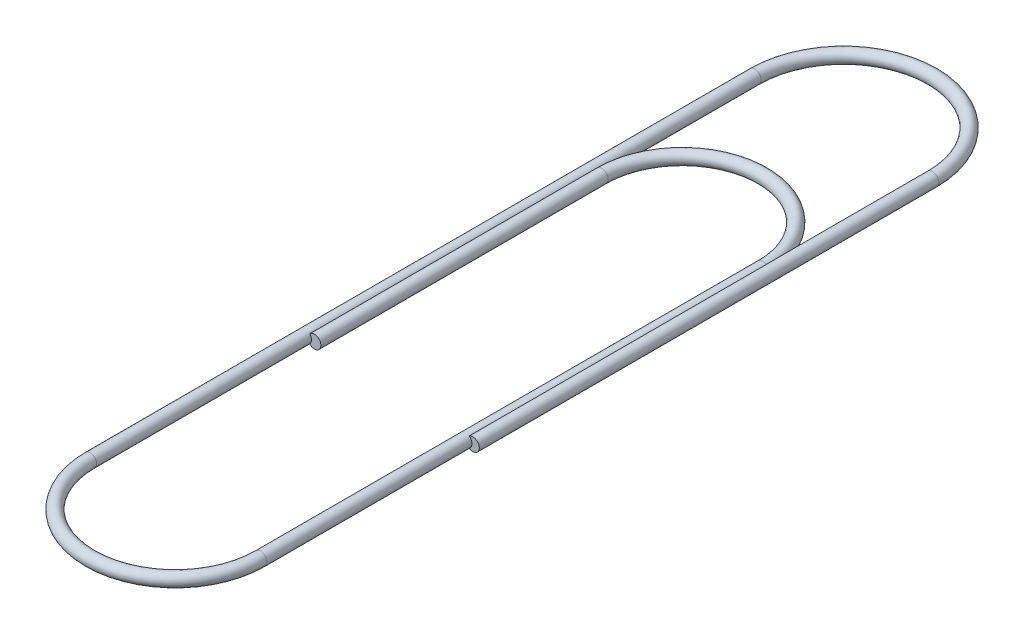
ISO-10303-21;
HEADER;
FILE_DESCRIPTION(('STEP AP214'),'2;1');
FILE_NAME('part.step','',(''),(''),'','','');
FILE_SCHEMA(('AUTOMOTIVE_DESIGN { 1 0 10303 214 1 1 1 1 }'));
ENDSEC;
DATA;
#1=APPLICATION_CONTEXT('core data for automotive mechanical design processes');
#2=APPLICATION_PROTOCOL_DEFINITION('international standard','automotive_design',2000,#1);
#3=PRODUCT_CONTEXT('',#1,'mechanical');
#4=PRODUCT('Part','Part','',(#3));
#5=PRODUCT_RELATED_PRODUCT_CATEGORY('part','',(#4));
#6=PRODUCT_DEFINITION_FORMATION('','',#4);
#7=PRODUCT_DEFINITION_CONTEXT('part definition',#1,'design');
#8=PRODUCT_DEFINITION('design','',#6,#7);
#9=PRODUCT_DEFINITION_SHAPE('','',#8);
#10=(LENGTH_UNIT() NAMED_UNIT(*) SI_UNIT(.MILLI.,.METRE.));
#11=(NAMED_UNIT(*) PLANE_ANGLE_UNIT() SI_UNIT($,.RADIAN.));
#12=(NAMED_UNIT(*) SI_UNIT($,.STERADIAN.) SOLID_ANGLE_UNIT());
#13=UNCERTAINTY_MEASURE_WITH_UNIT(LENGTH_MEASURE(1.E-05),#10,'distance_accuracy_value','');
#14=(GEOMETRIC_REPRESENTATION_CONTEXT(3) GLOBAL_UNCERTAINTY_ASSIGNED_CONTEXT((#13)) GLOBAL_UNIT_ASSIGNED_CONTEXT((#10,
#11,#12)) REPRESENTATION_CONTEXT('',''));
#15=CARTESIAN_POINT('',(0.,0.,0.));
#16=DIRECTION('',(0.,0.,1.));
#17=DIRECTION('',(1.,0.,0.));
#18=AXIS2_PLACEMENT_3D('',#15,#16,#17);
#19=CARTESIAN_POINT('',(0.,0.,0.));
#20=DIRECTION('',(0.,0.,-1.));
#21=DIRECTION('',(-1.,0.,0.));
#22=AXIS2_PLACEMENT_3D('',#19,#20,#21);
#23=CYLINDRICAL_SURFACE('',#22,0.254);
#24=CARTESIAN_POINT('',(0.,0.,0.));
#25=DIRECTION('',(0.,0.,1.));
#26=DIRECTION('',(1.,0.,0.));
#27=AXIS2_PLACEMENT_3D('',#24,#25,#26);
#28=CIRCLE('',#27,0.254);
#29=CARTESIAN_POINT('',(-0.186584561137967,-0.172343266607524,0.));
#30=VERTEX_POINT('',#29);
#31=CARTESIAN_POINT('',(-0.186584561137967,0.172343266607524,0.));
#32=VERTEX_POINT('',#31);
#33=EDGE_CURVE('E167',#30,#32,#28,.T.);
#34=ORIENTED_EDGE('',*,*,#33,.F.);
#35=DIRECTION('',(0.,0.,-1.));
#36=VECTOR('',#35,1.);
#37=CARTESIAN_POINT('',(-0.186584561137967,-0.172343266607524,-5.65589228056898));
#38=LINE('',#37,#36);
#39=CARTESIAN_POINT('',(-0.186584561137967,-0.172343266607524,-11.311784561138));
#40=VERTEX_POINT('',#39);
#41=EDGE_CURVE('E64',#30,#40,#38,.T.);
#42=ORIENTED_EDGE('',*,*,#41,.T.);
#43=CARTESIAN_POINT('',(0.,0.,-11.311784561138));
#44=DIRECTION('',(0.,0.,1.));
#45=DIRECTION('',(1.,0.,0.));
#46=AXIS2_PLACEMENT_3D('',#43,#44,#45);
#47=CIRCLE('',#46,0.254);
#48=CARTESIAN_POINT('',(-0.186584561137967,0.172343266607525,-11.311784561138));
#49=VERTEX_POINT('',#48);
#50=EDGE_CURVE('E171',#40,#49,#47,.T.);
#51=ORIENTED_EDGE('',*,*,#50,.T.);
#52=DIRECTION('',(0.,0.,-1.));
#53=VECTOR('',#52,1.);
#54=CARTESIAN_POINT('',(-0.186584561137967,0.172343266607524,-5.65589228056898));
#55=LINE('',#54,#53);
#56=EDGE_CURVE('E119',#49,#32,#55,.F.);
#57=ORIENTED_EDGE('',*,*,#56,.T.);
#58=EDGE_LOOP('',(#34,#42,#51,#57));
#59=FACE_BOUND('',#58,.T.);
#60=ADVANCED_FACE('F55',(#59),#23,.T.);
#61=CARTESIAN_POINT('',(-0.373169122275935,0.,8.4582));
#62=DIRECTION('',(0.,0.,-1.));
#63=DIRECTION('',(-1.,0.,0.));
#64=AXIS2_PLACEMENT_3D('',#61,#62,#63);
#65=CYLINDRICAL_SURFACE('',#64,0.254);
#66=CARTESIAN_POINT('',(-0.373169122275935,0.,8.4582));
#67=DIRECTION('',(0.,0.,1.));
#68=DIRECTION('',(1.,0.,0.));
#69=AXIS2_PLACEMENT_3D('',#66,#67,#68);
#70=CIRCLE('',#69,0.254);
#71=CARTESIAN_POINT('',(-0.627169122275934,0.,8.4582));
#72=VERTEX_POINT('',#71);
#73=EDGE_CURVE('E183',#72,#72,#70,.T.);
#74=ORIENTED_EDGE('',*,*,#73,.F.);
#75=EDGE_LOOP('',(#74));
#76=FACE_BOUND('',#75,.T.);
#77=CARTESIAN_POINT('',(-0.373169122275934,0.,-17.7130852795871));
#78=DIRECTION('',(0.,0.,1.));
#79=DIRECTION('',(1.,0.,0.));
#80=AXIS2_PLACEMENT_3D('',#77,#78,#79);
#81=CIRCLE('',#80,0.254);
#82=CARTESIAN_POINT('',(-0.627169122275934,0.,-17.7130852795871));
#83=VERTEX_POINT('',#82);
#84=EDGE_CURVE('E187',#83,#83,#81,.T.);
#85=ORIENTED_EDGE('',*,*,#84,.T.);
#86=EDGE_LOOP('',(#85));
#87=FACE_BOUND('',#86,.T.);
#88=CARTESIAN_POINT('',(-0.373169122275934,0.,0.));
#89=DIRECTION('',(0.,0.,1.));
#90=DIRECTION('',(1.,0.,0.));
#91=AXIS2_PLACEMENT_3D('',#88,#89,#90);
#92=CIRCLE('',#91,0.254);
#93=EDGE_CURVE('E12',#32,#30,#92,.F.);
#94=ORIENTED_EDGE('',*,*,#93,.F.);
#95=ORIENTED_EDGE('',*,*,#56,.F.);
#96=CARTESIAN_POINT('',(-0.186584558155385,-0.172343263378482,-11.311584561138));
#97=CARTESIAN_POINT('',(-0.186586348216467,-0.172330572164563,-11.3538157849771));
#98=CARTESIAN_POINT('',(-0.186188148576825,-0.171913108970192,-11.3960491957974));
#99=CARTESIAN_POINT('',(-0.184594814842463,-0.170172015622076,-11.4805070914564));
#100=CARTESIAN_POINT('',(-0.183399206966556,-0.16884784673543,-11.5227315560515));
#101=CARTESIAN_POINT('',(-0.180199896794127,-0.165180213971933,-11.6074843995857));
#102=CARTESIAN_POINT('',(-0.178189078791553,-0.162827760009676,-11.6500121282873));
#103=CARTESIAN_POINT('',(-0.173368058909582,-0.156878163210486,-11.7349276631901));
#104=CARTESIAN_POINT('',(-0.170558091677841,-0.153281385667111,-11.7773155067743));
#105=CARTESIAN_POINT('',(-0.164166707910229,-0.144440591878378,-11.861718537288));
#106=CARTESIAN_POINT('',(-0.160587835072099,-0.139201981550073,-11.9037344884641));
#107=CARTESIAN_POINT('',(-0.152691946696197,-0.126362211232276,-11.9872634904824));
#108=CARTESIAN_POINT('',(-0.148377023386179,-0.11876769915493,-12.0287776191115));
#109=CARTESIAN_POINT('',(-0.14142960680004,-0.104114492404558,-12.0902488463031));
#110=CARTESIAN_POINT('',(-0.139032601269161,-0.0986810766850316,-12.1106212973959));
#111=CARTESIAN_POINT('',(-0.134104234995789,-0.0861011052607425,-12.1509667350551));
#112=CARTESIAN_POINT('',(-0.131572405272602,-0.0789482181175577,-12.1709379425651));
#113=CARTESIAN_POINT('',(-0.127780291623346,-0.0657300990343296,-12.199890702032));
#114=CARTESIAN_POINT('',(-0.12651029404403,-0.0608759089702177,-12.2094233815019));
#115=CARTESIAN_POINT('',(-0.12403981553292,-0.0498403585831038,-12.2276882073835));
#116=CARTESIAN_POINT('',(-0.122838769467273,-0.0436726576851574,-12.2364273639686));
#117=CARTESIAN_POINT('',(-0.121448913812825,-0.0340274474268714,-12.2464252696653));
#118=CARTESIAN_POINT('',(-0.121133733108628,-0.0316324394347616,-12.248682984424));
#119=CARTESIAN_POINT('',(-0.12054830590342,-0.0265578869977523,-12.2528635452618));
#120=CARTESIAN_POINT('',(-0.120277992389521,-0.0238787768736094,-12.2547868909565));
#121=CARTESIAN_POINT('',(-0.119873889143989,-0.0190168949186507,-12.25765539599));
#122=CARTESIAN_POINT('',(-0.11972312453088,-0.016908975088872,-12.2587232613284));
#123=CARTESIAN_POINT('',(-0.119469874741796,-0.0125477767830832,-12.2605149147873));
#124=CARTESIAN_POINT('',(-0.119367329114311,-0.0102946843612895,-12.2612391337434));
#125=CARTESIAN_POINT('',(-0.119221630278729,-0.00566349794133679,-12.2622676089138));
#126=CARTESIAN_POINT('',(-0.119179137568722,-0.00328430796236838,-12.2625671948627));
#127=CARTESIAN_POINT('',(-0.119162289953431,0.00148600422398339,-12.2626860129643));
#128=CARTESIAN_POINT('',(-0.119187904763117,0.00387712065613724,-12.2625054586186));
#129=CARTESIAN_POINT('',(-0.119294598580724,0.00823297626470129,-12.2617525854919));
#130=CARTESIAN_POINT('',(-0.119367044507389,0.0102090436126411,-12.2612412374768));
#131=CARTESIAN_POINT('',(-0.119551416266909,0.0140636372209554,-12.2599382091467));
#132=CARTESIAN_POINT('',(-0.119663366133104,0.0159421033029232,-12.2591463581787));
#133=CARTESIAN_POINT('',(-0.12000146563066,0.0207658437118902,-12.2567509048164));
#134=CARTESIAN_POINT('',(-0.120254582946226,0.023612504353185,-12.2549539664389));
#135=CARTESIAN_POINT('',(-0.120815576235204,0.0290008207349535,-12.2509571088652));
#136=CARTESIAN_POINT('',(-0.121123630713269,0.0315414355581697,-12.2487558752933));
#137=CARTESIAN_POINT('',(-0.122092712811944,0.0387316878958819,-12.2418028848497));
#138=CARTESIAN_POINT('',(-0.122803142795208,0.0430006622214904,-12.2366702921147));
#139=CARTESIAN_POINT('',(-0.124278120882436,0.0508421063272673,-12.2259145947447));
#140=CARTESIAN_POINT('',(-0.125042833535231,0.0544123233435169,-12.2202899855322));
#141=CARTESIAN_POINT('',(-0.127201583482678,0.0636678131652967,-12.2042539861035));
#142=CARTESIAN_POINT('',(-0.128619678637136,0.0688211310794005,-12.1935419870365));
#143=CARTESIAN_POINT('',(-0.131455407960653,0.0781895375752967,-12.1717083547636));
#144=CARTESIAN_POINT('',(-0.132873031081389,0.0824021196667965,-12.1605857171053));
#145=CARTESIAN_POINT('',(-0.137095027915176,0.0941039862893652,-12.1267821966918));
#146=CARTESIAN_POINT('',(-0.139855828790263,0.100612312256754,-12.1037594597808));
#147=CARTESIAN_POINT('',(-0.145675932899513,0.113215139085398,-12.0529972765689));
#148=CARTESIAN_POINT('',(-0.148694122980351,0.119003150536537,-12.0251829623086));
#149=CARTESIAN_POINT('',(-0.154410077503749,0.129205595724694,-11.9692652059327));
#150=CARTESIAN_POINT('',(-0.157107717184953,0.133619495719756,-11.9411616558379));
#151=CARTESIAN_POINT('',(-0.164700285653789,0.145418685294031,-11.8564721600372));
#152=CARTESIAN_POINT('',(-0.169079729592196,0.151333761085013,-11.7996386789179));
#153=CARTESIAN_POINT('',(-0.176397509839829,0.160715052036092,-11.6857672908374));
#154=CARTESIAN_POINT('',(-0.179337495419138,0.164184071799184,-11.6287296936102));
#155=CARTESIAN_POINT('',(-0.183760573759929,0.169269024457319,-11.5145795765424));
#156=CARTESIAN_POINT('',(-0.185245327275353,0.17088707009237,-11.4574672167653));
#157=CARTESIAN_POINT('',(-0.186195287908378,0.171920735018546,-11.3855400437201));
#158=CARTESIAN_POINT('',(-0.186341738831967,0.172079924785346,-11.3707397484068));
#159=CARTESIAN_POINT('',(-0.186536531517962,0.172291455496945,-11.3411546093676));
#160=CARTESIAN_POINT('',(-0.186584984850286,0.172343917950816,-11.3263697672457));
#161=CARTESIAN_POINT('',(-0.186584558158359,0.17234326338175,-11.311584561138));
#162=B_SPLINE_CURVE_WITH_KNOTS('',3,(#96,#97,#98,#99,#100,#101,#102,#103,#104,#105,#106,#107,
#108,#109,#110,#111,#112,#113,#114,#115,#116,#117,#118,#119,#120,#121,#122,#123,#124,#125,#126,
#127,#128,#129,#130,#131,#132,#133,#134,#135,#136,#137,#138,#139,#140,#141,#142,#143,#144,#145,
#146,#147,#148,#149,#150,#151,#152,#153,#154,#155,#156,#157,#158,#159,#160,#161),.UNSPECIFIED.,
.F.,.F.,(4,2,2,2,2,2,2,2,2,2,2,2,2,2,2,2,2,2,2,2,2,2,2,2,2,2,2,2,2,2,2,2,4),(0.,
0.126693320019717,0.253461982186181,0.381361845234226,0.509224192794843,0.636669885604697,
0.763759172595573,0.827401849264348,0.891282560781645,0.923576500408086,0.955549716355383,
0.965448834470602,0.975333031726009,0.982412762219593,0.989483593126269,0.996631603624174,
1.00377643618364,1.00987933750187,1.01598595811252,1.02605470857441,1.03615679165994,
1.0561852455557,1.07627724351523,1.11209655098685,1.14801018576346,1.22014968690757,
1.30581759028636,1.39151872799094,1.56332497202887,1.73493390443677,1.90634676281408,
1.95075205205288,1.99510675750181),.UNSPECIFIED.);
#163=EDGE_CURVE('E114',#40,#49,#162,.T.);
#164=ORIENTED_EDGE('',*,*,#163,.F.);
#165=ORIENTED_EDGE('',*,*,#41,.F.);
#166=EDGE_LOOP('',(#94,#95,#164,#165));
#167=FACE_BOUND('',#166,.T.);
#168=ADVANCED_FACE('F130',(#76,#87,#167),#65,.T.);
#169=CARTESIAN_POINT('',(3.16621543886203,0.,-11.311784561138));
#170=DIRECTION('',(0.,-1.,0.));
#171=DIRECTION('',(0.,0.,-1.));
#172=AXIS2_PLACEMENT_3D('',#169,#170,#171);
#173=TOROIDAL_SURFACE('',#172,3.16621543886203,0.254);
#174=CARTESIAN_POINT('',(6.33243087772407,0.,-11.311784561138));
#175=DIRECTION('',(0.,0.,-1.));
#176=DIRECTION('',(-1.,0.,0.));
#177=AXIS2_PLACEMENT_3D('',#174,#175,#176);
#178=CIRCLE('',#177,0.254);
#179=CARTESIAN_POINT('',(6.47554559813694,-0.20984321957391,-11.311784561138));
#180=VERTEX_POINT('',#179);
#181=CARTESIAN_POINT('',(6.47554559813694,0.20984321957391,-11.311784561138));
#182=VERTEX_POINT('',#181);
#183=EDGE_CURVE('E174',#180,#182,#178,.T.);
#184=ORIENTED_EDGE('',*,*,#183,.T.);
#185=CARTESIAN_POINT('',(6.47554559511518,0.209843217513047,-11.311584561138));
#186=CARTESIAN_POINT('',(6.47554717750967,0.20983678138953,-11.3539414537054));
#187=CARTESIAN_POINT('',(6.47514155082372,0.209567451130886,-11.3962986889193));
#188=CARTESIAN_POINT('',(6.47351797282067,0.20845020626212,-11.4809979648741));
#189=CARTESIAN_POINT('',(6.47229986577094,0.207602180729531,-11.5233400011446));
#190=CARTESIAN_POINT('',(6.46905056214081,0.205272661193387,-11.6080512881441));
#191=CARTESIAN_POINT('',(6.46701793697716,0.203790053884052,-11.6504204554129));
#192=CARTESIAN_POINT('',(6.46214552745486,0.20007026662331,-11.7350731012108));
#193=CARTESIAN_POINT('',(6.45930582660759,0.197833164738032,-11.77735658815));
#194=CARTESIAN_POINT('',(6.45084962244025,0.190800232153149,-11.8875668394213));
#195=CARTESIAN_POINT('',(6.44459580698573,0.185275973933837,-11.9554066696937));
#196=CARTESIAN_POINT('',(6.43370982754808,0.174169779197072,-12.0567253516943));
#197=CARTESIAN_POINT('',(6.42982835753249,0.169995415294393,-12.0904387102716));
#198=CARTESIAN_POINT('',(6.42158494425384,0.160367307122796,-12.1576107903831));
#199=CARTESIAN_POINT('',(6.41722320621157,0.1549141081894,-12.1910696141976));
#200=CARTESIAN_POINT('',(6.40803412197785,0.142184938946614,-12.2577136073262));
#201=CARTESIAN_POINT('',(6.403205323421,0.134903162671867,-12.2908975504234));
#202=CARTESIAN_POINT('',(6.39569501651658,0.121765949320909,-12.3400242269292));
#203=CARTESIAN_POINT('',(6.39314857749264,0.117021093422404,-12.3562825719031));
#204=CARTESIAN_POINT('',(6.38799374501252,0.106508196510484,-12.3884502572382));
#205=CARTESIAN_POINT('',(6.38538542493403,0.100741319551075,-12.4043599717569));
#206=CARTESIAN_POINT('',(6.380811312859,0.0892837356044111,-12.4316803467014));
#207=CARTESIAN_POINT('',(6.37884612975425,0.0839268281840029,-12.443230689072));
#208=CARTESIAN_POINT('',(6.37496735693446,0.0719090919201962,-12.4656954283475));
#209=CARTESIAN_POINT('',(6.37305373844329,0.0652490082221755,-12.4766101840693));
#210=CARTESIAN_POINT('',(6.37034858578253,0.0535998227846687,-12.4918495777689));
#211=CARTESIAN_POINT('',(6.36947035762057,0.0494145373478933,-12.4967627362171));
#212=CARTESIAN_POINT('',(6.36783518824236,0.0403011768565564,-12.5058604866843));
#213=CARTESIAN_POINT('',(6.36707748155565,0.0353782100483896,-12.5100496927818));
#214=CARTESIAN_POINT('',(6.36614473411552,0.0275311733225606,-12.5151868501264));
#215=CARTESIAN_POINT('',(6.36587627947511,0.024967148606573,-12.5166619903399));
#216=CARTESIAN_POINT('',(6.36540728065884,0.0196476105388227,-12.5192355333283));
#217=CARTESIAN_POINT('',(6.36520670089105,0.016892198462392,-12.5203341335555));
#218=CARTESIAN_POINT('',(6.36489099578123,0.0111949688033155,-12.5220618999851));
#219=CARTESIAN_POINT('',(6.36477684910181,0.00825141409591514,-12.5226856904236));
#220=CARTESIAN_POINT('',(6.36465333131232,0.00229771352598996,-12.5233606516852));
#221=CARTESIAN_POINT('',(6.36464384528695,-0.000712355664161618,-12.5234124505437));
#222=CARTESIAN_POINT('',(6.3647257575405,-0.00634813060704933,-12.5229648885383));
#223=CARTESIAN_POINT('',(6.36480599157127,-0.00897917306099341,-12.5225265214709));
#224=CARTESIAN_POINT('',(6.3650408150475,-0.0141360038861796,-12.5212421483801));
#225=CARTESIAN_POINT('',(6.36519547233604,-0.0166616939325,-12.5203957704192));
#226=CARTESIAN_POINT('',(6.36564881829192,-0.0226694811805588,-12.5179110189648));
#227=CARTESIAN_POINT('',(6.36598099814671,-0.0260717821564932,-12.5160876691129));
#228=CARTESIAN_POINT('',(6.3667332200491,-0.0325487109120454,-12.5119464991582));
#229=CARTESIAN_POINT('',(6.36715349922598,-0.0356224198282702,-12.5096273441981));
#230=CARTESIAN_POINT('',(6.36843004118444,-0.0439409226676155,-12.5025589436775));
#231=CARTESIAN_POINT('',(6.36935505654756,-0.0488303914400835,-12.4974098374673));
#232=CARTESIAN_POINT('',(6.37129679633618,-0.0578659948213703,-12.4865207255351));
#233=CARTESIAN_POINT('',(6.37231379593016,-0.0620097802681334,-12.4807789390694));
#234=CARTESIAN_POINT('',(6.37503158220871,-0.0721342807259255,-12.4653125564332));
#235=CARTESIAN_POINT('',(6.37676816179239,-0.077676955782557,-12.4553106619927));
#236=CARTESIAN_POINT('',(6.38027248166657,-0.0878377697350292,-12.4348459350716));
#237=CARTESIAN_POINT('',(6.38204028811189,-0.0924536003688557,-12.4243820290547));
#238=CARTESIAN_POINT('',(6.38734902337236,-0.105353733674648,-12.3924960997913));
#239=CARTESIAN_POINT('',(6.39087895124843,-0.11263925574299,-12.3706722022768));
#240=CARTESIAN_POINT('',(6.39806741287445,-0.126158929747346,-12.3247873347661));
#241=CARTESIAN_POINT('',(6.40171327943685,-0.132260501294063,-12.3006881273881));
#242=CARTESIAN_POINT('',(6.40878462120099,-0.143214273194502,-12.2521702597898));
#243=CARTESIAN_POINT('',(6.41221001821753,-0.148066032138077,-12.2277514898968));
#244=CARTESIAN_POINT('',(6.42213086228085,-0.161294455142318,-12.1540915732712));
#245=CARTESIAN_POINT('',(6.42825301973698,-0.168314959660398,-12.1045608498485));
#246=CARTESIAN_POINT('',(6.43941986246328,-0.180145273053055,-12.0051004453491));
#247=CARTESIAN_POINT('',(6.44446373100992,-0.184953409377388,-11.95517049137));
#248=CARTESIAN_POINT('',(6.45343031763794,-0.19300636461402,-11.8551485647897));
#249=CARTESIAN_POINT('',(6.45735441127059,-0.196253104963609,-11.8050568680817));
#250=CARTESIAN_POINT('',(6.46318837466573,-0.200883298161527,-11.7179184008849));
#251=CARTESIAN_POINT('',(6.46535657318318,-0.202532178508363,-11.6809019255319));
#252=CARTESIAN_POINT('',(6.46907415296946,-0.205293399247089,-11.6068057139113));
#253=CARTESIAN_POINT('',(6.4706233334669,-0.206405565586203,-11.5697259610301));
#254=CARTESIAN_POINT('',(6.47308991662607,-0.208152875694833,-11.49580305643));
#255=CARTESIAN_POINT('',(6.4740118048864,-0.208791409312589,-11.4589601317735));
#256=CARTESIAN_POINT('',(6.47524017622036,-0.209634748813179,-11.3852729012239));
#257=CARTESIAN_POINT('',(6.4755468911645,-0.209839718116237,-11.3484286010878));
#258=CARTESIAN_POINT('',(6.47554559511288,-0.209843217514898,-11.3115845611379));
#259=B_SPLINE_CURVE_WITH_KNOTS('',3,(#185,#186,#187,#188,#189,#190,#191,#192,#193,#194,#195,
#196,#197,#198,#199,#200,#201,#202,#203,#204,#205,#206,#207,#208,#209,#210,#211,#212,#213,#214,
#215,#216,#217,#218,#219,#220,#221,#222,#223,#224,#225,#226,#227,#228,#229,#230,#231,#232,#233,
#234,#235,#236,#237,#238,#239,#240,#241,#242,#243,#244,#245,#246,#247,#248,#249,#250,#251,#252,
#253,#254,#255,#256,#257,#258),.UNSPECIFIED.,.F.,.F.,(4,2,2,2,2,2,2,2,2,2,2,2,2,2,2,2,2,2,2,2,2,
2,2,2,2,2,2,2,2,2,2,2,2,2,2,2,4),(0.,0.127068261726136,0.254160886335624,0.381477401211878,
0.508780746928111,0.713717770818611,0.816271902525519,0.918782381189669,1.02162255265801,
1.07298460276539,1.12428852452994,1.16290591355761,1.20150128567085,1.22099927858014,
1.24036801007796,1.24925482721683,1.2581369770793,1.26711825271241,1.27608966610287,
1.28405771657214,1.2920330443901,1.3035895461056,1.31517756231039,1.33653897550713,
1.35796654939796,1.3925751593806,1.42726891967032,1.49697470134095,1.57231474705693,
1.6476813650813,1.79877075020003,1.94997417197035,2.10099104524392,2.21233232009539,
2.32370967795699,2.43428199227612,2.54481262194997),.UNSPECIFIED.);
#260=EDGE_CURVE('E98',#182,#180,#259,.T.);
#261=ORIENTED_EDGE('',*,*,#260,.T.);
#262=EDGE_LOOP('',(#184,#261));
#263=FACE_BOUND('',#262,.T.);
#264=ORIENTED_EDGE('',*,*,#50,.F.);
#265=ORIENTED_EDGE('',*,*,#163,.T.);
#266=EDGE_LOOP('',(#264,#265));
#267=FACE_BOUND('',#266,.T.);
#268=ADVANCED_FACE('F134',(#263,#267),#173,.T.);
#269=CARTESIAN_POINT('',(6.33243087772407,0.,-11.311784561138));
#270=DIRECTION('',(0.,0.,1.));
#271=DIRECTION('',(1.,0.,0.));
#272=AXIS2_PLACEMENT_3D('',#269,#270,#271);
#273=CYLINDRICAL_SURFACE('',#272,0.254);
#274=CARTESIAN_POINT('',(6.33243087772407,0.,8.4582));
#275=DIRECTION('',(0.,0.,-1.));
#276=DIRECTION('',(-1.,0.,0.));
#277=AXIS2_PLACEMENT_3D('',#274,#275,#276);
#278=CIRCLE('',#277,0.254);
#279=CARTESIAN_POINT('',(6.58643087772406,0.,8.4582));
#280=VERTEX_POINT('',#279);
#281=EDGE_CURVE('E179',#280,#280,#278,.T.);
#282=ORIENTED_EDGE('',*,*,#281,.T.);
#283=EDGE_LOOP('',(#282));
#284=FACE_BOUND('',#283,.T.);
#285=ORIENTED_EDGE('',*,*,#183,.F.);
#286=DIRECTION('',(0.,0.,1.));
#287=VECTOR('',#286,1.);
#288=CARTESIAN_POINT('',(6.47554559813694,-0.20984321957391,-1.42679228056898));
#289=LINE('',#288,#287);
#290=CARTESIAN_POINT('',(6.47554559813694,-0.20984321957391,0.380999999999999));
#291=VERTEX_POINT('',#290);
#292=EDGE_CURVE('E112',#180,#291,#289,.T.);
#293=ORIENTED_EDGE('',*,*,#292,.T.);
#294=CARTESIAN_POINT('',(6.33243087772407,0.,0.380999999999999));
#295=DIRECTION('',(0.,0.,-1.));
#296=DIRECTION('',(-1.,0.,0.));
#297=AXIS2_PLACEMENT_3D('',#294,#295,#296);
#298=CIRCLE('',#297,0.254);
#299=CARTESIAN_POINT('',(6.47554559813694,0.20984321957391,0.380999999999999));
#300=VERTEX_POINT('',#299);
#301=EDGE_CURVE('E107',#291,#300,#298,.F.);
#302=ORIENTED_EDGE('',*,*,#301,.T.);
#303=DIRECTION('',(0.,0.,1.));
#304=VECTOR('',#303,1.);
#305=CARTESIAN_POINT('',(6.47554559813694,0.20984321957391,-1.42679228056898));
#306=LINE('',#305,#304);
#307=EDGE_CURVE('E92',#300,#182,#306,.F.);
#308=ORIENTED_EDGE('',*,*,#307,.T.);
#309=EDGE_LOOP('',(#285,#293,#302,#308));
#310=FACE_BOUND('',#309,.T.);
#311=ADVANCED_FACE('F111',(#284,#310),#273,.T.);
#312=CARTESIAN_POINT('',(6.61866031854982,0.,-17.7130852795871));
#313=DIRECTION('',(0.,0.,1.));
#314=DIRECTION('',(1.,0.,0.));
#315=AXIS2_PLACEMENT_3D('',#312,#313,#314);
#316=CYLINDRICAL_SURFACE('',#315,0.254);
#317=CARTESIAN_POINT('',(6.61866031854982,0.,-17.7130852795871));
#318=DIRECTION('',(0.,0.,-1.));
#319=DIRECTION('',(-1.,0.,0.));
#320=AXIS2_PLACEMENT_3D('',#317,#318,#319);
#321=CIRCLE('',#320,0.254);
#322=CARTESIAN_POINT('',(6.87266031854982,0.,-17.7130852795871));
#323=VERTEX_POINT('',#322);
#324=EDGE_CURVE('E109',#323,#323,#321,.T.);
#325=ORIENTED_EDGE('',*,*,#324,.F.);
#326=EDGE_LOOP('',(#325));
#327=FACE_BOUND('',#326,.T.);
#328=ORIENTED_EDGE('',*,*,#292,.F.);
#329=ORIENTED_EDGE('',*,*,#260,.F.);
#330=ORIENTED_EDGE('',*,*,#307,.F.);
#331=CARTESIAN_POINT('',(6.61866031854982,0.,0.380999999999999));
#332=DIRECTION('',(0.,0.,-1.));
#333=DIRECTION('',(-1.,0.,0.));
#334=AXIS2_PLACEMENT_3D('',#331,#332,#333);
#335=CIRCLE('',#334,0.254);
#336=EDGE_CURVE('E95',#300,#291,#335,.T.);
#337=ORIENTED_EDGE('',*,*,#336,.T.);
#338=EDGE_LOOP('',(#328,#329,#330,#337));
#339=FACE_BOUND('',#338,.T.);
#340=ADVANCED_FACE('F94',(#327,#339),#316,.T.);
#341=CARTESIAN_POINT('',(0.,0.,0.));
#342=DIRECTION('',(0.,0.,1.));
#343=DIRECTION('',(1.,0.,0.));
#344=AXIS2_PLACEMENT_3D('',#341,#342,#343);
#345=PLANE('',#344);
#346=ORIENTED_EDGE('',*,*,#33,.T.);
#347=ORIENTED_EDGE('',*,*,#93,.T.);
#348=EDGE_LOOP('',(#346,#347));
#349=FACE_BOUND('',#348,.T.);
#350=ADVANCED_FACE('F57',(#349),#345,.T.);
#351=CARTESIAN_POINT('',(6.61866031854982,0.,0.380999999999999));
#352=DIRECTION('',(0.,0.,-1.));
#353=DIRECTION('',(-1.,0.,0.));
#354=AXIS2_PLACEMENT_3D('',#351,#352,#353);
#355=PLANE('',#354);
#356=ORIENTED_EDGE('',*,*,#301,.F.);
#357=ORIENTED_EDGE('',*,*,#336,.F.);
#358=EDGE_LOOP('',(#356,#357));
#359=FACE_BOUND('',#358,.T.);
#360=ADVANCED_FACE('F106',(#359),#355,.F.);
#361=CARTESIAN_POINT('',(2.97963087772407,0.,8.4582));
#362=DIRECTION('',(0.,-1.,0.));
#363=DIRECTION('',(0.,0.,-1.));
#364=AXIS2_PLACEMENT_3D('',#361,#362,#363);
#365=TOROIDAL_SURFACE('',#364,3.3528,0.254);
#366=CARTESIAN_POINT('',(2.97963087772407,0.,8.4582));
#367=DIRECTION('',(0.,-1.,0.));
#368=DIRECTION('',(0.,0.,-1.));
#369=AXIS2_PLACEMENT_3D('',#366,#367,#368);
#370=CIRCLE('',#369,3.6068);
#371=EDGE_CURVE('',#280,#72,#370,.T.);
#372=ORIENTED_EDGE('',*,*,#281,.F.);
#373=ORIENTED_EDGE('',*,*,#73,.T.);
#374=ORIENTED_EDGE('',*,*,#371,.T.);
#375=ORIENTED_EDGE('',*,*,#371,.F.);
#376=EDGE_LOOP('',(#372,#374,#373,#375));
#377=FACE_BOUND('',#376,.T.);
#378=ADVANCED_FACE('F152',(#377),#365,.T.);
#379=CARTESIAN_POINT('',(3.12274559813694,0.,-17.7130852795871));
#380=DIRECTION('',(0.,-1.,0.));
#381=DIRECTION('',(0.,0.,-1.));
#382=AXIS2_PLACEMENT_3D('',#379,#380,#381);
#383=TOROIDAL_SURFACE('',#382,3.49591472041288,0.254);
#384=CARTESIAN_POINT('',(3.12274559813694,0.,-17.7130852795871));
#385=DIRECTION('',(0.,-1.,0.));
#386=DIRECTION('',(0.,0.,-1.));
#387=AXIS2_PLACEMENT_3D('',#384,#385,#386);
#388=CIRCLE('',#387,3.74991472041288);
#389=EDGE_CURVE('',#83,#323,#388,.T.);
#390=ORIENTED_EDGE('',*,*,#84,.F.);
#391=ORIENTED_EDGE('',*,*,#324,.T.);
#392=ORIENTED_EDGE('',*,*,#389,.T.);
#393=ORIENTED_EDGE('',*,*,#389,.F.);
#394=EDGE_LOOP('',(#390,#392,#391,#393));
#395=FACE_BOUND('',#394,.T.);
#396=ADVANCED_FACE('F150',(#395),#383,.T.);
#397=CLOSED_SHELL('',(#60,#168,#268,#311,#340,#350,#360,#378,#396));
#398=MANIFOLD_SOLID_BREP('B2',#397);
#399=ADVANCED_BREP_SHAPE_REPRESENTATION('',(#18,#398),#14);
#400=SHAPE_DEFINITION_REPRESENTATION(#9,#399);
ENDSEC;
END-ISO-10303-21;
